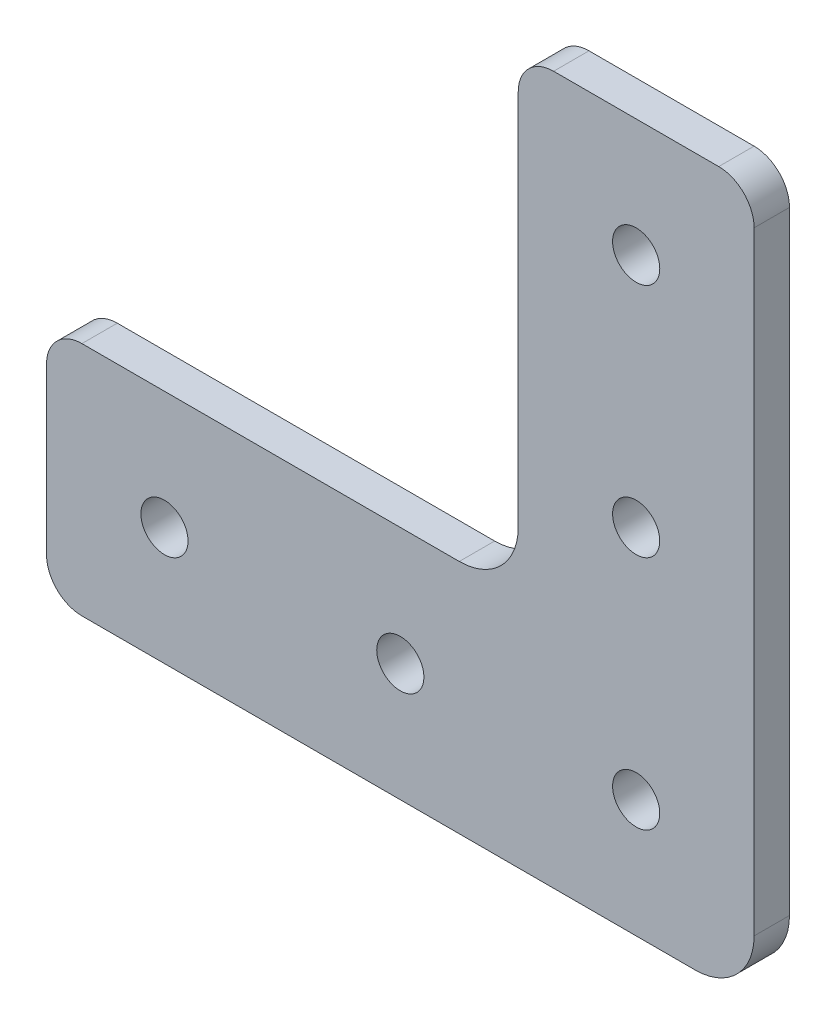
ISO-10303-21;
HEADER;
FILE_DESCRIPTION(('STEP AP214'),'2;1');
FILE_NAME('part.step','',(''),(''),'','','');
FILE_SCHEMA(('AUTOMOTIVE_DESIGN { 1 0 10303 214 1 1 1 1 }'));
ENDSEC;
DATA;
#1=APPLICATION_CONTEXT('core data for automotive mechanical design processes');
#2=APPLICATION_PROTOCOL_DEFINITION('international standard','automotive_design',2000,#1);
#3=PRODUCT_CONTEXT('',#1,'mechanical');
#4=PRODUCT('Part','Part','',(#3));
#5=PRODUCT_RELATED_PRODUCT_CATEGORY('part','',(#4));
#6=PRODUCT_DEFINITION_FORMATION('','',#4);
#7=PRODUCT_DEFINITION_CONTEXT('part definition',#1,'design');
#8=PRODUCT_DEFINITION('design','',#6,#7);
#9=PRODUCT_DEFINITION_SHAPE('','',#8);
#10=(LENGTH_UNIT() NAMED_UNIT(*) SI_UNIT(.MILLI.,.METRE.));
#11=(NAMED_UNIT(*) PLANE_ANGLE_UNIT() SI_UNIT($,.RADIAN.));
#12=(NAMED_UNIT(*) SI_UNIT($,.STERADIAN.) SOLID_ANGLE_UNIT());
#13=UNCERTAINTY_MEASURE_WITH_UNIT(LENGTH_MEASURE(1.E-05),#10,'distance_accuracy_value','');
#14=(GEOMETRIC_REPRESENTATION_CONTEXT(3) GLOBAL_UNCERTAINTY_ASSIGNED_CONTEXT((#13)) GLOBAL_UNIT_ASSIGNED_CONTEXT((#10,
#11,#12)) REPRESENTATION_CONTEXT('',''));
#15=CARTESIAN_POINT('',(0.,0.,0.));
#16=DIRECTION('',(0.,0.,1.));
#17=DIRECTION('',(1.,0.,0.));
#18=AXIS2_PLACEMENT_3D('',#15,#16,#17);
#19=CARTESIAN_POINT('',(0.,0.,3.));
#20=DIRECTION('',(1.,0.,0.));
#21=DIRECTION('',(0.,0.,-1.));
#22=AXIS2_PLACEMENT_3D('',#19,#20,#21);
#23=PLANE('',#22);
#24=DIRECTION('',(0.,-1.,0.));
#25=VECTOR('',#24,1.);
#26=CARTESIAN_POINT('',(0.,0.,3.));
#27=LINE('',#26,#25);
#28=CARTESIAN_POINT('',(0.,57.,3.));
#29=VERTEX_POINT('',#28);
#30=CARTESIAN_POINT('',(0.,25.,3.));
#31=VERTEX_POINT('',#30);
#32=EDGE_CURVE('E209',#29,#31,#27,.T.);
#33=ORIENTED_EDGE('',*,*,#32,.F.);
#34=DIRECTION('',(0.,0.,-1.));
#35=VECTOR('',#34,1.);
#36=CARTESIAN_POINT('',(0.,57.,3.));
#37=LINE('',#36,#35);
#38=CARTESIAN_POINT('',(0.,57.,0.));
#39=VERTEX_POINT('',#38);
#40=EDGE_CURVE('E11',#29,#39,#37,.T.);
#41=ORIENTED_EDGE('',*,*,#40,.T.);
#42=DIRECTION('',(0.,-1.,0.));
#43=VECTOR('',#42,1.);
#44=CARTESIAN_POINT('',(0.,0.,0.));
#45=LINE('',#44,#43);
#46=CARTESIAN_POINT('',(0.,25.,0.));
#47=VERTEX_POINT('',#46);
#48=EDGE_CURVE('E213',#39,#47,#45,.T.);
#49=ORIENTED_EDGE('',*,*,#48,.T.);
#50=DIRECTION('',(0.,0.,1.));
#51=VECTOR('',#50,1.);
#52=CARTESIAN_POINT('',(0.,25.,3.));
#53=LINE('',#52,#51);
#54=EDGE_CURVE('E144',#47,#31,#53,.T.);
#55=ORIENTED_EDGE('',*,*,#54,.T.);
#56=EDGE_LOOP('',(#33,#41,#49,#55));
#57=FACE_BOUND('',#56,.T.);
#58=ADVANCED_FACE('F41',(#57),#23,.F.);
#59=CARTESIAN_POINT('',(0.,0.,3.));
#60=DIRECTION('',(0.,1.,0.));
#61=DIRECTION('',(0.,0.,1.));
#62=AXIS2_PLACEMENT_3D('',#59,#60,#61);
#63=PLANE('',#62);
#64=DIRECTION('',(1.,0.,0.));
#65=VECTOR('',#64,1.);
#66=CARTESIAN_POINT('',(0.,0.,3.));
#67=LINE('',#66,#65);
#68=CARTESIAN_POINT('',(-37.,0.,3.));
#69=VERTEX_POINT('',#68);
#70=CARTESIAN_POINT('',(15.,0.,3.));
#71=VERTEX_POINT('',#70);
#72=EDGE_CURVE('E139',#69,#71,#67,.T.);
#73=ORIENTED_EDGE('',*,*,#72,.F.);
#74=DIRECTION('',(0.,0.,1.));
#75=VECTOR('',#74,1.);
#76=CARTESIAN_POINT('',(-37.,0.,0.));
#77=LINE('',#76,#75);
#78=CARTESIAN_POINT('',(-37.,0.,0.));
#79=VERTEX_POINT('',#78);
#80=EDGE_CURVE('E189',#69,#79,#77,.F.);
#81=ORIENTED_EDGE('',*,*,#80,.T.);
#82=DIRECTION('',(1.,0.,0.));
#83=VECTOR('',#82,1.);
#84=CARTESIAN_POINT('',(0.,0.,0.));
#85=LINE('',#84,#83);
#86=CARTESIAN_POINT('',(15.,0.,0.));
#87=VERTEX_POINT('',#86);
#88=EDGE_CURVE('E212',#79,#87,#85,.T.);
#89=ORIENTED_EDGE('',*,*,#88,.T.);
#90=DIRECTION('',(0.,0.,-1.));
#91=VECTOR('',#90,1.);
#92=CARTESIAN_POINT('',(15.,0.,3.));
#93=LINE('',#92,#91);
#94=EDGE_CURVE('E145',#87,#71,#93,.F.);
#95=ORIENTED_EDGE('',*,*,#94,.T.);
#96=EDGE_LOOP('',(#73,#81,#89,#95));
#97=FACE_BOUND('',#96,.T.);
#98=ADVANCED_FACE('F286',(#97),#63,.F.);
#99=CARTESIAN_POINT('',(20.,0.,3.));
#100=DIRECTION('',(-1.,0.,0.));
#101=DIRECTION('',(0.,-1.,0.));
#102=AXIS2_PLACEMENT_3D('',#99,#100,#101);
#103=PLANE('',#102);
#104=DIRECTION('',(0.,1.,0.));
#105=VECTOR('',#104,1.);
#106=CARTESIAN_POINT('',(20.,0.,0.));
#107=LINE('',#106,#105);
#108=CARTESIAN_POINT('',(20.,5.,0.));
#109=VERTEX_POINT('',#108);
#110=CARTESIAN_POINT('',(20.,57.,0.));
#111=VERTEX_POINT('',#110);
#112=EDGE_CURVE('E210',#109,#111,#107,.T.);
#113=ORIENTED_EDGE('',*,*,#112,.T.);
#114=DIRECTION('',(0.,0.,-1.));
#115=VECTOR('',#114,1.);
#116=CARTESIAN_POINT('',(20.,57.,3.));
#117=LINE('',#116,#115);
#118=CARTESIAN_POINT('',(20.,57.,3.));
#119=VERTEX_POINT('',#118);
#120=EDGE_CURVE('E49',#111,#119,#117,.F.);
#121=ORIENTED_EDGE('',*,*,#120,.T.);
#122=DIRECTION('',(0.,1.,0.));
#123=VECTOR('',#122,1.);
#124=CARTESIAN_POINT('',(20.,0.,3.));
#125=LINE('',#124,#123);
#126=CARTESIAN_POINT('',(20.,5.,3.));
#127=VERTEX_POINT('',#126);
#128=EDGE_CURVE('E136',#127,#119,#125,.T.);
#129=ORIENTED_EDGE('',*,*,#128,.F.);
#130=DIRECTION('',(0.,0.,-1.));
#131=VECTOR('',#130,1.);
#132=CARTESIAN_POINT('',(20.,5.,3.));
#133=LINE('',#132,#131);
#134=EDGE_CURVE('E151',#127,#109,#133,.T.);
#135=ORIENTED_EDGE('',*,*,#134,.T.);
#136=EDGE_LOOP('',(#113,#121,#129,#135));
#137=FACE_BOUND('',#136,.T.);
#138=ADVANCED_FACE('F150',(#137),#103,.F.);
#139=CARTESIAN_POINT('',(0.,60.,3.));
#140=DIRECTION('',(0.,-1.,0.));
#141=DIRECTION('',(0.,0.,-1.));
#142=AXIS2_PLACEMENT_3D('',#139,#140,#141);
#143=PLANE('',#142);
#144=DIRECTION('',(-1.,0.,0.));
#145=VECTOR('',#144,1.);
#146=CARTESIAN_POINT('',(0.,60.,3.));
#147=LINE('',#146,#145);
#148=CARTESIAN_POINT('',(17.,60.,3.));
#149=VERTEX_POINT('',#148);
#150=CARTESIAN_POINT('',(3.,60.,3.));
#151=VERTEX_POINT('',#150);
#152=EDGE_CURVE('E153',#149,#151,#147,.T.);
#153=ORIENTED_EDGE('',*,*,#152,.F.);
#154=DIRECTION('',(0.,0.,-1.));
#155=VECTOR('',#154,1.);
#156=CARTESIAN_POINT('',(17.,60.,3.));
#157=LINE('',#156,#155);
#158=CARTESIAN_POINT('',(17.,60.,0.));
#159=VERTEX_POINT('',#158);
#160=EDGE_CURVE('E202',#149,#159,#157,.T.);
#161=ORIENTED_EDGE('',*,*,#160,.T.);
#162=DIRECTION('',(-1.,0.,0.));
#163=VECTOR('',#162,1.);
#164=CARTESIAN_POINT('',(0.,60.,0.));
#165=LINE('',#164,#163);
#166=CARTESIAN_POINT('',(3.,60.,0.));
#167=VERTEX_POINT('',#166);
#168=EDGE_CURVE('E163',#159,#167,#165,.T.);
#169=ORIENTED_EDGE('',*,*,#168,.T.);
#170=DIRECTION('',(0.,0.,-1.));
#171=VECTOR('',#170,1.);
#172=CARTESIAN_POINT('',(3.,60.,3.));
#173=LINE('',#172,#171);
#174=EDGE_CURVE('E200',#167,#151,#173,.F.);
#175=ORIENTED_EDGE('',*,*,#174,.T.);
#176=EDGE_LOOP('',(#153,#161,#169,#175));
#177=FACE_BOUND('',#176,.T.);
#178=ADVANCED_FACE('F205',(#177),#143,.F.);
#179=CARTESIAN_POINT('',(0.,0.,3.));
#180=DIRECTION('',(0.,0.,-1.));
#181=DIRECTION('',(-1.,0.,0.));
#182=AXIS2_PLACEMENT_3D('',#179,#180,#181);
#183=PLANE('',#182);
#184=CARTESIAN_POINT('',(-30.,10.,3.));
#185=DIRECTION('',(0.,0.,1.));
#186=DIRECTION('',(-1.,0.,0.));
#187=AXIS2_PLACEMENT_3D('',#184,#185,#186);
#188=CIRCLE('',#187,2.);
#189=CARTESIAN_POINT('',(-32.,10.,3.));
#190=VERTEX_POINT('',#189);
#191=EDGE_CURVE('E239',#190,#190,#188,.T.);
#192=ORIENTED_EDGE('',*,*,#191,.F.);
#193=EDGE_LOOP('',(#192));
#194=FACE_BOUND('',#193,.T.);
#195=CARTESIAN_POINT('',(-9.99999999999999,10.,3.));
#196=DIRECTION('',(0.,0.,1.));
#197=DIRECTION('',(-1.,0.,0.));
#198=AXIS2_PLACEMENT_3D('',#195,#196,#197);
#199=CIRCLE('',#198,2.);
#200=CARTESIAN_POINT('',(-12.,10.,3.));
#201=VERTEX_POINT('',#200);
#202=EDGE_CURVE('E245',#201,#201,#199,.T.);
#203=ORIENTED_EDGE('',*,*,#202,.F.);
#204=EDGE_LOOP('',(#203));
#205=FACE_BOUND('',#204,.T.);
#206=CARTESIAN_POINT('',(9.99999999999999,50.,3.));
#207=DIRECTION('',(0.,0.,1.));
#208=DIRECTION('',(1.,0.,0.));
#209=AXIS2_PLACEMENT_3D('',#206,#207,#208);
#210=CIRCLE('',#209,2.);
#211=CARTESIAN_POINT('',(12.,50.,3.));
#212=VERTEX_POINT('',#211);
#213=EDGE_CURVE('E251',#212,#212,#210,.T.);
#214=ORIENTED_EDGE('',*,*,#213,.F.);
#215=EDGE_LOOP('',(#214));
#216=FACE_BOUND('',#215,.T.);
#217=CARTESIAN_POINT('',(10.,30.,3.));
#218=DIRECTION('',(0.,0.,1.));
#219=DIRECTION('',(1.,0.,0.));
#220=AXIS2_PLACEMENT_3D('',#217,#218,#219);
#221=CIRCLE('',#220,2.);
#222=CARTESIAN_POINT('',(12.,30.,3.));
#223=VERTEX_POINT('',#222);
#224=EDGE_CURVE('E233',#223,#223,#221,.T.);
#225=ORIENTED_EDGE('',*,*,#224,.F.);
#226=EDGE_LOOP('',(#225));
#227=FACE_BOUND('',#226,.T.);
#228=CARTESIAN_POINT('',(10.,10.,3.));
#229=DIRECTION('',(0.,0.,1.));
#230=DIRECTION('',(1.,0.,0.));
#231=AXIS2_PLACEMENT_3D('',#228,#229,#230);
#232=CIRCLE('',#231,2.);
#233=CARTESIAN_POINT('',(12.,10.,3.));
#234=VERTEX_POINT('',#233);
#235=EDGE_CURVE('E230',#234,#234,#232,.T.);
#236=ORIENTED_EDGE('',*,*,#235,.F.);
#237=EDGE_LOOP('',(#236));
#238=FACE_BOUND('',#237,.T.);
#239=DIRECTION('',(0.,-1.,0.));
#240=VECTOR('',#239,1.);
#241=CARTESIAN_POINT('',(-40.,0.,3.));
#242=LINE('',#241,#240);
#243=CARTESIAN_POINT('',(-40.,17.,3.));
#244=VERTEX_POINT('',#243);
#245=CARTESIAN_POINT('',(-40.,3.,3.));
#246=VERTEX_POINT('',#245);
#247=EDGE_CURVE('E219',#244,#246,#242,.T.);
#248=ORIENTED_EDGE('',*,*,#247,.T.);
#249=CARTESIAN_POINT('',(-37.,3.,3.));
#250=DIRECTION('',(0.,0.,-1.));
#251=DIRECTION('',(-1.,0.,0.));
#252=AXIS2_PLACEMENT_3D('',#249,#250,#251);
#253=CIRCLE('',#252,3.);
#254=EDGE_CURVE('E187',#246,#69,#253,.F.);
#255=ORIENTED_EDGE('',*,*,#254,.T.);
#256=ORIENTED_EDGE('',*,*,#72,.T.);
#257=CARTESIAN_POINT('',(15.,5.,3.));
#258=DIRECTION('',(0.,0.,-1.));
#259=DIRECTION('',(-1.,0.,0.));
#260=AXIS2_PLACEMENT_3D('',#257,#258,#259);
#261=CIRCLE('',#260,5.);
#262=EDGE_CURVE('E132',#71,#127,#261,.F.);
#263=ORIENTED_EDGE('',*,*,#262,.T.);
#264=ORIENTED_EDGE('',*,*,#128,.T.);
#265=CARTESIAN_POINT('',(17.,57.,3.));
#266=DIRECTION('',(0.,0.,-1.));
#267=DIRECTION('',(-1.,0.,0.));
#268=AXIS2_PLACEMENT_3D('',#265,#266,#267);
#269=CIRCLE('',#268,3.);
#270=EDGE_CURVE('E183',#119,#149,#269,.F.);
#271=ORIENTED_EDGE('',*,*,#270,.T.);
#272=ORIENTED_EDGE('',*,*,#152,.T.);
#273=CARTESIAN_POINT('',(3.,57.,3.));
#274=DIRECTION('',(0.,0.,-1.));
#275=DIRECTION('',(-1.,0.,0.));
#276=AXIS2_PLACEMENT_3D('',#273,#274,#275);
#277=CIRCLE('',#276,3.);
#278=EDGE_CURVE('E181',#151,#29,#277,.F.);
#279=ORIENTED_EDGE('',*,*,#278,.T.);
#280=ORIENTED_EDGE('',*,*,#32,.T.);
#281=CARTESIAN_POINT('',(-5.,25.,3.));
#282=DIRECTION('',(0.,0.,-1.));
#283=DIRECTION('',(-1.,0.,0.));
#284=AXIS2_PLACEMENT_3D('',#281,#282,#283);
#285=CIRCLE('',#284,5.);
#286=CARTESIAN_POINT('',(-5.,20.,3.));
#287=VERTEX_POINT('',#286);
#288=EDGE_CURVE('E171',#31,#287,#285,.T.);
#289=ORIENTED_EDGE('',*,*,#288,.T.);
#290=DIRECTION('',(-1.,0.,0.));
#291=VECTOR('',#290,1.);
#292=CARTESIAN_POINT('',(20.,20.,3.));
#293=LINE('',#292,#291);
#294=CARTESIAN_POINT('',(-37.,20.,3.));
#295=VERTEX_POINT('',#294);
#296=EDGE_CURVE('E222',#287,#295,#293,.T.);
#297=ORIENTED_EDGE('',*,*,#296,.T.);
#298=CARTESIAN_POINT('',(-37.,17.,3.));
#299=DIRECTION('',(0.,0.,-1.));
#300=DIRECTION('',(-1.,0.,0.));
#301=AXIS2_PLACEMENT_3D('',#298,#299,#300);
#302=CIRCLE('',#301,3.);
#303=EDGE_CURVE('E185',#295,#244,#302,.F.);
#304=ORIENTED_EDGE('',*,*,#303,.T.);
#305=EDGE_LOOP('',(#248,#255,#256,#263,#264,#271,#272,#279,#280,#289,#297,#304));
#306=FACE_BOUND('',#305,.T.);
#307=ADVANCED_FACE('F135',(#194,#205,#216,#227,#238,#306),#183,.F.);
#308=CARTESIAN_POINT('',(0.,0.,0.));
#309=DIRECTION('',(0.,0.,-1.));
#310=DIRECTION('',(-1.,0.,0.));
#311=AXIS2_PLACEMENT_3D('',#308,#309,#310);
#312=PLANE('',#311);
#313=CARTESIAN_POINT('',(-30.,10.,0.));
#314=DIRECTION('',(0.,0.,1.));
#315=DIRECTION('',(-1.,0.,0.));
#316=AXIS2_PLACEMENT_3D('',#313,#314,#315);
#317=CIRCLE('',#316,2.);
#318=CARTESIAN_POINT('',(-32.,10.,0.));
#319=VERTEX_POINT('',#318);
#320=EDGE_CURVE('E236',#319,#319,#317,.T.);
#321=ORIENTED_EDGE('',*,*,#320,.T.);
#322=EDGE_LOOP('',(#321));
#323=FACE_BOUND('',#322,.T.);
#324=CARTESIAN_POINT('',(-9.99999999999999,10.,0.));
#325=DIRECTION('',(0.,0.,1.));
#326=DIRECTION('',(-1.,0.,0.));
#327=AXIS2_PLACEMENT_3D('',#324,#325,#326);
#328=CIRCLE('',#327,2.);
#329=CARTESIAN_POINT('',(-12.,10.,0.));
#330=VERTEX_POINT('',#329);
#331=EDGE_CURVE('E242',#330,#330,#328,.T.);
#332=ORIENTED_EDGE('',*,*,#331,.T.);
#333=EDGE_LOOP('',(#332));
#334=FACE_BOUND('',#333,.T.);
#335=CARTESIAN_POINT('',(9.99999999999999,50.,0.));
#336=DIRECTION('',(0.,0.,1.));
#337=DIRECTION('',(1.,0.,0.));
#338=AXIS2_PLACEMENT_3D('',#335,#336,#337);
#339=CIRCLE('',#338,2.);
#340=CARTESIAN_POINT('',(12.,50.,0.));
#341=VERTEX_POINT('',#340);
#342=EDGE_CURVE('E248',#341,#341,#339,.T.);
#343=ORIENTED_EDGE('',*,*,#342,.T.);
#344=EDGE_LOOP('',(#343));
#345=FACE_BOUND('',#344,.T.);
#346=CARTESIAN_POINT('',(10.,30.,0.));
#347=DIRECTION('',(0.,0.,1.));
#348=DIRECTION('',(1.,0.,0.));
#349=AXIS2_PLACEMENT_3D('',#346,#347,#348);
#350=CIRCLE('',#349,2.);
#351=CARTESIAN_POINT('',(12.,30.,0.));
#352=VERTEX_POINT('',#351);
#353=EDGE_CURVE('E254',#352,#352,#350,.T.);
#354=ORIENTED_EDGE('',*,*,#353,.T.);
#355=EDGE_LOOP('',(#354));
#356=FACE_BOUND('',#355,.T.);
#357=CARTESIAN_POINT('',(10.,10.,0.));
#358=DIRECTION('',(0.,0.,1.));
#359=DIRECTION('',(1.,0.,0.));
#360=AXIS2_PLACEMENT_3D('',#357,#358,#359);
#361=CIRCLE('',#360,2.);
#362=CARTESIAN_POINT('',(12.,10.,0.));
#363=VERTEX_POINT('',#362);
#364=EDGE_CURVE('E225',#363,#363,#361,.T.);
#365=ORIENTED_EDGE('',*,*,#364,.T.);
#366=EDGE_LOOP('',(#365));
#367=FACE_BOUND('',#366,.T.);
#368=ORIENTED_EDGE('',*,*,#88,.F.);
#369=CARTESIAN_POINT('',(-37.,3.,0.));
#370=DIRECTION('',(0.,0.,-1.));
#371=DIRECTION('',(-1.,0.,0.));
#372=AXIS2_PLACEMENT_3D('',#369,#370,#371);
#373=CIRCLE('',#372,3.);
#374=CARTESIAN_POINT('',(-40.,3.,0.));
#375=VERTEX_POINT('',#374);
#376=EDGE_CURVE('E195',#79,#375,#373,.T.);
#377=ORIENTED_EDGE('',*,*,#376,.T.);
#378=DIRECTION('',(0.,-1.,0.));
#379=VECTOR('',#378,1.);
#380=CARTESIAN_POINT('',(-40.,0.,0.));
#381=LINE('',#380,#379);
#382=CARTESIAN_POINT('',(-40.,17.,0.));
#383=VERTEX_POINT('',#382);
#384=EDGE_CURVE('E216',#383,#375,#381,.T.);
#385=ORIENTED_EDGE('',*,*,#384,.F.);
#386=CARTESIAN_POINT('',(-37.,17.,0.));
#387=DIRECTION('',(0.,0.,-1.));
#388=DIRECTION('',(-1.,0.,0.));
#389=AXIS2_PLACEMENT_3D('',#386,#387,#388);
#390=CIRCLE('',#389,3.);
#391=CARTESIAN_POINT('',(-37.,20.,0.));
#392=VERTEX_POINT('',#391);
#393=EDGE_CURVE('E193',#383,#392,#390,.T.);
#394=ORIENTED_EDGE('',*,*,#393,.T.);
#395=DIRECTION('',(-1.,0.,0.));
#396=VECTOR('',#395,1.);
#397=CARTESIAN_POINT('',(20.,20.,0.));
#398=LINE('',#397,#396);
#399=CARTESIAN_POINT('',(-5.,20.,0.));
#400=VERTEX_POINT('',#399);
#401=EDGE_CURVE('E221',#400,#392,#398,.T.);
#402=ORIENTED_EDGE('',*,*,#401,.F.);
#403=CARTESIAN_POINT('',(-5.,25.,0.));
#404=DIRECTION('',(0.,0.,-1.));
#405=DIRECTION('',(-1.,0.,0.));
#406=AXIS2_PLACEMENT_3D('',#403,#404,#405);
#407=CIRCLE('',#406,5.);
#408=EDGE_CURVE('E173',#400,#47,#407,.F.);
#409=ORIENTED_EDGE('',*,*,#408,.T.);
#410=ORIENTED_EDGE('',*,*,#48,.F.);
#411=CARTESIAN_POINT('',(3.,57.,0.));
#412=DIRECTION('',(0.,0.,-1.));
#413=DIRECTION('',(-1.,0.,0.));
#414=AXIS2_PLACEMENT_3D('',#411,#412,#413);
#415=CIRCLE('',#414,3.);
#416=EDGE_CURVE('E56',#39,#167,#415,.T.);
#417=ORIENTED_EDGE('',*,*,#416,.T.);
#418=ORIENTED_EDGE('',*,*,#168,.F.);
#419=CARTESIAN_POINT('',(17.,57.,0.));
#420=DIRECTION('',(0.,0.,-1.));
#421=DIRECTION('',(-1.,0.,0.));
#422=AXIS2_PLACEMENT_3D('',#419,#420,#421);
#423=CIRCLE('',#422,3.);
#424=EDGE_CURVE('E64',#159,#111,#423,.T.);
#425=ORIENTED_EDGE('',*,*,#424,.T.);
#426=ORIENTED_EDGE('',*,*,#112,.F.);
#427=CARTESIAN_POINT('',(15.,5.,0.));
#428=DIRECTION('',(0.,0.,-1.));
#429=DIRECTION('',(-1.,0.,0.));
#430=AXIS2_PLACEMENT_3D('',#427,#428,#429);
#431=CIRCLE('',#430,5.);
#432=EDGE_CURVE('E157',#109,#87,#431,.T.);
#433=ORIENTED_EDGE('',*,*,#432,.T.);
#434=EDGE_LOOP('',(#368,#377,#385,#394,#402,#409,#410,#417,#418,#425,#426,#433));
#435=FACE_BOUND('',#434,.T.);
#436=ADVANCED_FACE('F208',(#323,#334,#345,#356,#367,#435),#312,.T.);
#437=CARTESIAN_POINT('',(20.,20.,0.));
#438=DIRECTION('',(0.,1.,0.));
#439=DIRECTION('',(-1.,0.,0.));
#440=AXIS2_PLACEMENT_3D('',#437,#438,#439);
#441=PLANE('',#440);
#442=ORIENTED_EDGE('',*,*,#401,.T.);
#443=DIRECTION('',(0.,0.,1.));
#444=VECTOR('',#443,1.);
#445=CARTESIAN_POINT('',(-37.,20.,0.));
#446=LINE('',#445,#444);
#447=EDGE_CURVE('E197',#392,#295,#446,.T.);
#448=ORIENTED_EDGE('',*,*,#447,.T.);
#449=ORIENTED_EDGE('',*,*,#296,.F.);
#450=DIRECTION('',(0.,0.,1.));
#451=VECTOR('',#450,1.);
#452=CARTESIAN_POINT('',(-5.,20.,0.));
#453=LINE('',#452,#451);
#454=EDGE_CURVE('E169',#287,#400,#453,.F.);
#455=ORIENTED_EDGE('',*,*,#454,.T.);
#456=EDGE_LOOP('',(#442,#448,#449,#455));
#457=FACE_BOUND('',#456,.T.);
#458=ADVANCED_FACE('F280',(#457),#441,.T.);
#459=CARTESIAN_POINT('',(-40.,0.,0.));
#460=DIRECTION('',(-1.,0.,0.));
#461=DIRECTION('',(0.,0.,1.));
#462=AXIS2_PLACEMENT_3D('',#459,#460,#461);
#463=PLANE('',#462);
#464=ORIENTED_EDGE('',*,*,#384,.T.);
#465=DIRECTION('',(0.,0.,1.));
#466=VECTOR('',#465,1.);
#467=CARTESIAN_POINT('',(-40.,3.,3.));
#468=LINE('',#467,#466);
#469=EDGE_CURVE('E178',#375,#246,#468,.T.);
#470=ORIENTED_EDGE('',*,*,#469,.T.);
#471=ORIENTED_EDGE('',*,*,#247,.F.);
#472=DIRECTION('',(0.,0.,1.));
#473=VECTOR('',#472,1.);
#474=CARTESIAN_POINT('',(-40.,17.,0.));
#475=LINE('',#474,#473);
#476=EDGE_CURVE('E176',#244,#383,#475,.F.);
#477=ORIENTED_EDGE('',*,*,#476,.T.);
#478=EDGE_LOOP('',(#464,#470,#471,#477));
#479=FACE_BOUND('',#478,.T.);
#480=ADVANCED_FACE('F270',(#479),#463,.T.);
#481=CARTESIAN_POINT('',(10.,10.,0.));
#482=DIRECTION('',(0.,0.,1.));
#483=DIRECTION('',(1.,0.,0.));
#484=AXIS2_PLACEMENT_3D('',#481,#482,#483);
#485=CYLINDRICAL_SURFACE('',#484,2.);
#486=ORIENTED_EDGE('',*,*,#364,.F.);
#487=EDGE_LOOP('',(#486));
#488=FACE_BOUND('',#487,.T.);
#489=ORIENTED_EDGE('',*,*,#235,.T.);
#490=EDGE_LOOP('',(#489));
#491=FACE_BOUND('',#490,.T.);
#492=ADVANCED_FACE('F268',(#488,#491),#485,.F.);
#493=CARTESIAN_POINT('',(10.,30.,0.));
#494=DIRECTION('',(0.,0.,1.));
#495=DIRECTION('',(1.,0.,0.));
#496=AXIS2_PLACEMENT_3D('',#493,#494,#495);
#497=CYLINDRICAL_SURFACE('',#496,2.);
#498=ORIENTED_EDGE('',*,*,#353,.F.);
#499=EDGE_LOOP('',(#498));
#500=FACE_BOUND('',#499,.T.);
#501=ORIENTED_EDGE('',*,*,#224,.T.);
#502=EDGE_LOOP('',(#501));
#503=FACE_BOUND('',#502,.T.);
#504=ADVANCED_FACE('F260',(#500,#503),#497,.F.);
#505=CARTESIAN_POINT('',(9.99999999999999,50.,0.));
#506=DIRECTION('',(0.,0.,1.));
#507=DIRECTION('',(1.,0.,0.));
#508=AXIS2_PLACEMENT_3D('',#505,#506,#507);
#509=CYLINDRICAL_SURFACE('',#508,2.);
#510=ORIENTED_EDGE('',*,*,#342,.F.);
#511=EDGE_LOOP('',(#510));
#512=FACE_BOUND('',#511,.T.);
#513=ORIENTED_EDGE('',*,*,#213,.T.);
#514=EDGE_LOOP('',(#513));
#515=FACE_BOUND('',#514,.T.);
#516=ADVANCED_FACE('F276',(#512,#515),#509,.F.);
#517=CARTESIAN_POINT('',(-9.99999999999999,10.,0.));
#518=DIRECTION('',(0.,0.,1.));
#519=DIRECTION('',(1.,0.,0.));
#520=AXIS2_PLACEMENT_3D('',#517,#518,#519);
#521=CYLINDRICAL_SURFACE('',#520,2.);
#522=ORIENTED_EDGE('',*,*,#331,.F.);
#523=EDGE_LOOP('',(#522));
#524=FACE_BOUND('',#523,.T.);
#525=ORIENTED_EDGE('',*,*,#202,.T.);
#526=EDGE_LOOP('',(#525));
#527=FACE_BOUND('',#526,.T.);
#528=ADVANCED_FACE('F396',(#524,#527),#521,.F.);
#529=CARTESIAN_POINT('',(-30.,10.,0.));
#530=DIRECTION('',(0.,0.,1.));
#531=DIRECTION('',(1.,0.,0.));
#532=AXIS2_PLACEMENT_3D('',#529,#530,#531);
#533=CYLINDRICAL_SURFACE('',#532,2.);
#534=ORIENTED_EDGE('',*,*,#320,.F.);
#535=EDGE_LOOP('',(#534));
#536=FACE_BOUND('',#535,.T.);
#537=ORIENTED_EDGE('',*,*,#191,.T.);
#538=EDGE_LOOP('',(#537));
#539=FACE_BOUND('',#538,.T.);
#540=ADVANCED_FACE('F301',(#536,#539),#533,.F.);
#541=CARTESIAN_POINT('',(15.,5.,3.));
#542=DIRECTION('',(0.,0.,-1.));
#543=DIRECTION('',(-1.,0.,0.));
#544=AXIS2_PLACEMENT_3D('',#541,#542,#543);
#545=CYLINDRICAL_SURFACE('',#544,5.);
#546=ORIENTED_EDGE('',*,*,#262,.F.);
#547=ORIENTED_EDGE('',*,*,#94,.F.);
#548=ORIENTED_EDGE('',*,*,#432,.F.);
#549=ORIENTED_EDGE('',*,*,#134,.F.);
#550=EDGE_LOOP('',(#546,#547,#548,#549));
#551=FACE_BOUND('',#550,.T.);
#552=ADVANCED_FACE('F155',(#551),#545,.T.);
#553=CARTESIAN_POINT('',(-5.,25.,3.));
#554=DIRECTION('',(0.,0.,1.));
#555=DIRECTION('',(1.,0.,0.));
#556=AXIS2_PLACEMENT_3D('',#553,#554,#555);
#557=CYLINDRICAL_SURFACE('',#556,5.);
#558=ORIENTED_EDGE('',*,*,#408,.F.);
#559=ORIENTED_EDGE('',*,*,#454,.F.);
#560=ORIENTED_EDGE('',*,*,#288,.F.);
#561=ORIENTED_EDGE('',*,*,#54,.F.);
#562=EDGE_LOOP('',(#558,#559,#560,#561));
#563=FACE_BOUND('',#562,.T.);
#564=ADVANCED_FACE('F300',(#563),#557,.F.);
#565=CARTESIAN_POINT('',(-37.,3.,0.));
#566=DIRECTION('',(0.,0.,-1.));
#567=DIRECTION('',(-1.,0.,0.));
#568=AXIS2_PLACEMENT_3D('',#565,#566,#567);
#569=CYLINDRICAL_SURFACE('',#568,3.);
#570=ORIENTED_EDGE('',*,*,#376,.F.);
#571=ORIENTED_EDGE('',*,*,#80,.F.);
#572=ORIENTED_EDGE('',*,*,#254,.F.);
#573=ORIENTED_EDGE('',*,*,#469,.F.);
#574=EDGE_LOOP('',(#570,#571,#572,#573));
#575=FACE_BOUND('',#574,.T.);
#576=ADVANCED_FACE('F303',(#575),#569,.T.);
#577=CARTESIAN_POINT('',(-37.,17.,0.));
#578=DIRECTION('',(0.,0.,1.));
#579=DIRECTION('',(1.,0.,0.));
#580=AXIS2_PLACEMENT_3D('',#577,#578,#579);
#581=CYLINDRICAL_SURFACE('',#580,3.);
#582=ORIENTED_EDGE('',*,*,#393,.F.);
#583=ORIENTED_EDGE('',*,*,#476,.F.);
#584=ORIENTED_EDGE('',*,*,#303,.F.);
#585=ORIENTED_EDGE('',*,*,#447,.F.);
#586=EDGE_LOOP('',(#582,#583,#584,#585));
#587=FACE_BOUND('',#586,.T.);
#588=ADVANCED_FACE('F307',(#587),#581,.T.);
#589=CARTESIAN_POINT('',(17.,57.,3.));
#590=DIRECTION('',(0.,0.,-1.));
#591=DIRECTION('',(-1.,0.,0.));
#592=AXIS2_PLACEMENT_3D('',#589,#590,#591);
#593=CYLINDRICAL_SURFACE('',#592,3.);
#594=ORIENTED_EDGE('',*,*,#270,.F.);
#595=ORIENTED_EDGE('',*,*,#120,.F.);
#596=ORIENTED_EDGE('',*,*,#424,.F.);
#597=ORIENTED_EDGE('',*,*,#160,.F.);
#598=EDGE_LOOP('',(#594,#595,#596,#597));
#599=FACE_BOUND('',#598,.T.);
#600=ADVANCED_FACE('F310',(#599),#593,.T.);
#601=CARTESIAN_POINT('',(3.,57.,3.));
#602=DIRECTION('',(0.,0.,-1.));
#603=DIRECTION('',(-1.,0.,0.));
#604=AXIS2_PLACEMENT_3D('',#601,#602,#603);
#605=CYLINDRICAL_SURFACE('',#604,3.);
#606=ORIENTED_EDGE('',*,*,#278,.F.);
#607=ORIENTED_EDGE('',*,*,#174,.F.);
#608=ORIENTED_EDGE('',*,*,#416,.F.);
#609=ORIENTED_EDGE('',*,*,#40,.F.);
#610=EDGE_LOOP('',(#606,#607,#608,#609));
#611=FACE_BOUND('',#610,.T.);
#612=ADVANCED_FACE('F43',(#611),#605,.T.);
#613=CLOSED_SHELL('',(#58,#98,#138,#178,#307,#436,#458,#480,#492,#504,#516,#528,#540,#552,#564,
#576,#588,#600,#612));
#614=MANIFOLD_SOLID_BREP('B2',#613);
#615=ADVANCED_BREP_SHAPE_REPRESENTATION('',(#18,#614),#14);
#616=SHAPE_DEFINITION_REPRESENTATION(#9,#615);
ENDSEC;
END-ISO-10303-21;
